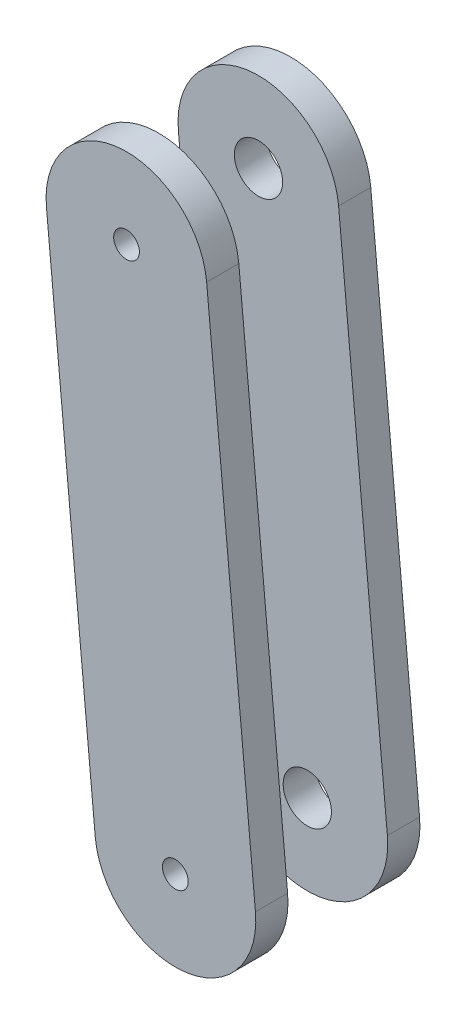
ISO-10303-21;
HEADER;
FILE_DESCRIPTION(('STEP AP214'),'2;1');
FILE_NAME('part.step','',(''),(''),'','','');
FILE_SCHEMA(('AUTOMOTIVE_DESIGN { 1 0 10303 214 1 1 1 1 }'));
ENDSEC;
DATA;
#1=APPLICATION_CONTEXT('core data for automotive mechanical design processes');
#2=APPLICATION_PROTOCOL_DEFINITION('international standard','automotive_design',2000,#1);
#3=PRODUCT_CONTEXT('',#1,'mechanical');
#4=PRODUCT('Part','Part','',(#3));
#5=PRODUCT_RELATED_PRODUCT_CATEGORY('part','',(#4));
#6=PRODUCT_DEFINITION_FORMATION('','',#4);
#7=PRODUCT_DEFINITION_CONTEXT('part definition',#1,'design');
#8=PRODUCT_DEFINITION('design','',#6,#7);
#9=PRODUCT_DEFINITION_SHAPE('','',#8);
#10=(LENGTH_UNIT() NAMED_UNIT(*) SI_UNIT(.MILLI.,.METRE.));
#11=(NAMED_UNIT(*) PLANE_ANGLE_UNIT() SI_UNIT($,.RADIAN.));
#12=(NAMED_UNIT(*) SI_UNIT($,.STERADIAN.) SOLID_ANGLE_UNIT());
#13=UNCERTAINTY_MEASURE_WITH_UNIT(LENGTH_MEASURE(1.E-05),#10,'distance_accuracy_value','');
#14=(GEOMETRIC_REPRESENTATION_CONTEXT(3) GLOBAL_UNCERTAINTY_ASSIGNED_CONTEXT((#13)) GLOBAL_UNIT_ASSIGNED_CONTEXT((#10,
#11,#12)) REPRESENTATION_CONTEXT('',''));
#15=CARTESIAN_POINT('',(0.,0.,0.));
#16=DIRECTION('',(0.,0.,1.));
#17=DIRECTION('',(1.,0.,0.));
#18=AXIS2_PLACEMENT_3D('',#15,#16,#17);
#19=CARTESIAN_POINT('',(-36.066679679603,64.7397826272147,-16.4));
#20=DIRECTION('',(0.,0.,-1.));
#21=DIRECTION('',(-1.,0.,0.));
#22=AXIS2_PLACEMENT_3D('',#19,#20,#21);
#23=PLANE('',#22);
#24=CARTESIAN_POINT('',(-30.,0.,-16.4));
#25=DIRECTION('',(0.,0.,-1.));
#26=DIRECTION('',(-1.,0.,0.));
#27=AXIS2_PLACEMENT_3D('',#24,#25,#26);
#28=CIRCLE('',#27,3.);
#29=CARTESIAN_POINT('',(-33.,0.,-16.4));
#30=VERTEX_POINT('',#29);
#31=EDGE_CURVE('E110',#30,#30,#28,.T.);
#32=ORIENTED_EDGE('',*,*,#31,.F.);
#33=EDGE_LOOP('',(#32));
#34=FACE_BOUND('',#33,.T.);
#35=CARTESIAN_POINT('',(-36.066679679603,64.7397826272147,-16.4));
#36=DIRECTION('',(0.,0.,-1.));
#37=DIRECTION('',(-1.,0.,0.));
#38=AXIS2_PLACEMENT_3D('',#35,#36,#37);
#39=CIRCLE('',#38,9.99999999999999);
#40=CARTESIAN_POINT('',(-46.0230601628289,63.8067833382336,-16.4));
#41=VERTEX_POINT('',#40);
#42=CARTESIAN_POINT('',(-26.1102991963772,65.6727819161958,-16.4));
#43=VERTEX_POINT('',#42);
#44=EDGE_CURVE('E95',#41,#43,#39,.T.);
#45=ORIENTED_EDGE('',*,*,#44,.T.);
#46=DIRECTION('',(0.0932999288981102,-0.995638048322586,0.));
#47=VECTOR('',#46,1.);
#48=CARTESIAN_POINT('',(-26.1102991963772,65.6727819161958,-16.4));
#49=LINE('',#48,#47);
#50=CARTESIAN_POINT('',(-20.0436195167741,0.932999288981099,-16.4));
#51=VERTEX_POINT('',#50);
#52=EDGE_CURVE('E90',#43,#51,#49,.T.);
#53=ORIENTED_EDGE('',*,*,#52,.T.);
#54=CARTESIAN_POINT('',(-30.,0.,-16.4));
#55=DIRECTION('',(0.,0.,-1.));
#56=DIRECTION('',(-1.,0.,0.));
#57=AXIS2_PLACEMENT_3D('',#54,#55,#56);
#58=CIRCLE('',#57,9.99999999999999);
#59=CARTESIAN_POINT('',(-39.9563804832258,-0.9329992889811,-16.4));
#60=VERTEX_POINT('',#59);
#61=EDGE_CURVE('E93',#51,#60,#58,.T.);
#62=ORIENTED_EDGE('',*,*,#61,.T.);
#63=DIRECTION('',(-0.0932999288981101,0.995638048322586,0.));
#64=VECTOR('',#63,1.);
#65=CARTESIAN_POINT('',(-39.9563804832258,-0.9329992889811,-16.4));
#66=LINE('',#65,#64);
#67=EDGE_CURVE('E60',#60,#41,#66,.T.);
#68=ORIENTED_EDGE('',*,*,#67,.T.);
#69=EDGE_LOOP('',(#45,#53,#62,#68));
#70=FACE_BOUND('',#69,.T.);
#71=CARTESIAN_POINT('',(-36.066679679603,64.7397826272147,-16.4));
#72=DIRECTION('',(0.,0.,-1.));
#73=DIRECTION('',(-1.,0.,0.));
#74=AXIS2_PLACEMENT_3D('',#71,#72,#73);
#75=CIRCLE('',#74,3.);
#76=CARTESIAN_POINT('',(-39.066679679603,64.7397826272147,-16.4));
#77=VERTEX_POINT('',#76);
#78=EDGE_CURVE('E125',#77,#77,#75,.T.);
#79=ORIENTED_EDGE('',*,*,#78,.F.);
#80=EDGE_LOOP('',(#79));
#81=FACE_BOUND('',#80,.T.);
#82=ADVANCED_FACE('F43',(#34,#70,#81),#23,.T.);
#83=CARTESIAN_POINT('',(-36.066679679603,64.7397826272147,-12.4));
#84=DIRECTION('',(0.,0.,-1.));
#85=DIRECTION('',(-1.,0.,0.));
#86=AXIS2_PLACEMENT_3D('',#83,#84,#85);
#87=PLANE('',#86);
#88=CARTESIAN_POINT('',(-36.066679679603,64.7397826272147,-12.4));
#89=DIRECTION('',(0.,0.,-1.));
#90=DIRECTION('',(-1.,0.,0.));
#91=AXIS2_PLACEMENT_3D('',#88,#89,#90);
#92=CIRCLE('',#91,9.99999999999999);
#93=CARTESIAN_POINT('',(-46.0230601628289,63.8067833382336,-12.4));
#94=VERTEX_POINT('',#93);
#95=CARTESIAN_POINT('',(-26.1102991963772,65.6727819161958,-12.4));
#96=VERTEX_POINT('',#95);
#97=EDGE_CURVE('E107',#94,#96,#92,.T.);
#98=ORIENTED_EDGE('',*,*,#97,.F.);
#99=DIRECTION('',(-0.0932999288981101,0.995638048322586,0.));
#100=VECTOR('',#99,1.);
#101=CARTESIAN_POINT('',(-39.9563804832258,-0.9329992889811,-12.4));
#102=LINE('',#101,#100);
#103=CARTESIAN_POINT('',(-39.9563804832258,-0.9329992889811,-12.4));
#104=VERTEX_POINT('',#103);
#105=EDGE_CURVE('E83',#104,#94,#102,.T.);
#106=ORIENTED_EDGE('',*,*,#105,.F.);
#107=CARTESIAN_POINT('',(-30.,0.,-12.4));
#108=DIRECTION('',(0.,0.,-1.));
#109=DIRECTION('',(-1.,0.,0.));
#110=AXIS2_PLACEMENT_3D('',#107,#108,#109);
#111=CIRCLE('',#110,9.99999999999999);
#112=CARTESIAN_POINT('',(-20.0436195167741,0.932999288981099,-12.4));
#113=VERTEX_POINT('',#112);
#114=EDGE_CURVE('E77',#113,#104,#111,.T.);
#115=ORIENTED_EDGE('',*,*,#114,.F.);
#116=DIRECTION('',(0.0932999288981102,-0.995638048322586,0.));
#117=VECTOR('',#116,1.);
#118=CARTESIAN_POINT('',(-26.1102991963772,65.6727819161958,-12.4));
#119=LINE('',#118,#117);
#120=EDGE_CURVE('E99',#96,#113,#119,.T.);
#121=ORIENTED_EDGE('',*,*,#120,.F.);
#122=EDGE_LOOP('',(#98,#106,#115,#121));
#123=FACE_BOUND('',#122,.T.);
#124=CARTESIAN_POINT('',(-30.,0.,-12.4));
#125=DIRECTION('',(0.,0.,-1.));
#126=DIRECTION('',(-1.,0.,0.));
#127=AXIS2_PLACEMENT_3D('',#124,#125,#126);
#128=CIRCLE('',#127,3.);
#129=CARTESIAN_POINT('',(-33.,0.,-12.4));
#130=VERTEX_POINT('',#129);
#131=EDGE_CURVE('E122',#130,#130,#128,.T.);
#132=ORIENTED_EDGE('',*,*,#131,.T.);
#133=EDGE_LOOP('',(#132));
#134=FACE_BOUND('',#133,.T.);
#135=CARTESIAN_POINT('',(-36.066679679603,64.7397826272147,-12.4));
#136=DIRECTION('',(0.,0.,-1.));
#137=DIRECTION('',(-1.,0.,0.));
#138=AXIS2_PLACEMENT_3D('',#135,#136,#137);
#139=CIRCLE('',#138,3.);
#140=CARTESIAN_POINT('',(-39.066679679603,64.7397826272147,-12.4));
#141=VERTEX_POINT('',#140);
#142=EDGE_CURVE('E128',#141,#141,#139,.T.);
#143=ORIENTED_EDGE('',*,*,#142,.T.);
#144=EDGE_LOOP('',(#143));
#145=FACE_BOUND('',#144,.T.);
#146=ADVANCED_FACE('F118',(#123,#134,#145),#87,.F.);
#147=CARTESIAN_POINT('',(-36.066679679603,64.7397826272147,-16.4));
#148=DIRECTION('',(0.,0.,1.));
#149=DIRECTION('',(1.,0.,0.));
#150=AXIS2_PLACEMENT_3D('',#147,#148,#149);
#151=CYLINDRICAL_SURFACE('',#150,9.99999999999999);
#152=ORIENTED_EDGE('',*,*,#97,.T.);
#153=DIRECTION('',(0.,0.,1.));
#154=VECTOR('',#153,1.);
#155=CARTESIAN_POINT('',(-26.1102991963772,65.6727819161958,-16.4));
#156=LINE('',#155,#154);
#157=EDGE_CURVE('E12',#43,#96,#156,.T.);
#158=ORIENTED_EDGE('',*,*,#157,.F.);
#159=ORIENTED_EDGE('',*,*,#44,.F.);
#160=DIRECTION('',(0.,0.,1.));
#161=VECTOR('',#160,1.);
#162=CARTESIAN_POINT('',(-46.0230601628289,63.8067833382336,-16.4));
#163=LINE('',#162,#161);
#164=EDGE_CURVE('E103',#41,#94,#163,.T.);
#165=ORIENTED_EDGE('',*,*,#164,.T.);
#166=EDGE_LOOP('',(#152,#158,#159,#165));
#167=FACE_BOUND('',#166,.T.);
#168=ADVANCED_FACE('F45',(#167),#151,.T.);
#169=CARTESIAN_POINT('',(-26.1102991963772,65.6727819161958,-16.4));
#170=DIRECTION('',(-0.995638048322586,-0.0932999288981102,0.));
#171=DIRECTION('',(0.0932999288981102,-0.995638048322586,0.));
#172=AXIS2_PLACEMENT_3D('',#169,#170,#171);
#173=PLANE('',#172);
#174=ORIENTED_EDGE('',*,*,#120,.T.);
#175=DIRECTION('',(0.,0.,1.));
#176=VECTOR('',#175,1.);
#177=CARTESIAN_POINT('',(-20.0436195167741,0.932999288981099,-16.4));
#178=LINE('',#177,#176);
#179=EDGE_CURVE('E52',#51,#113,#178,.T.);
#180=ORIENTED_EDGE('',*,*,#179,.F.);
#181=ORIENTED_EDGE('',*,*,#52,.F.);
#182=ORIENTED_EDGE('',*,*,#157,.T.);
#183=EDGE_LOOP('',(#174,#180,#181,#182));
#184=FACE_BOUND('',#183,.T.);
#185=ADVANCED_FACE('F98',(#184),#173,.F.);
#186=CARTESIAN_POINT('',(-30.,0.,-16.4));
#187=DIRECTION('',(0.,0.,1.));
#188=DIRECTION('',(1.,0.,0.));
#189=AXIS2_PLACEMENT_3D('',#186,#187,#188);
#190=CYLINDRICAL_SURFACE('',#189,9.99999999999999);
#191=ORIENTED_EDGE('',*,*,#114,.T.);
#192=DIRECTION('',(0.,0.,1.));
#193=VECTOR('',#192,1.);
#194=CARTESIAN_POINT('',(-39.9563804832258,-0.9329992889811,-16.4));
#195=LINE('',#194,#193);
#196=EDGE_CURVE('E100',#60,#104,#195,.T.);
#197=ORIENTED_EDGE('',*,*,#196,.F.);
#198=ORIENTED_EDGE('',*,*,#61,.F.);
#199=ORIENTED_EDGE('',*,*,#179,.T.);
#200=EDGE_LOOP('',(#191,#197,#198,#199));
#201=FACE_BOUND('',#200,.T.);
#202=ADVANCED_FACE('F101',(#201),#190,.T.);
#203=CARTESIAN_POINT('',(-39.9563804832258,-0.9329992889811,-16.4));
#204=DIRECTION('',(0.995638048322586,0.0932999288981101,0.));
#205=DIRECTION('',(-0.0932999288981101,0.995638048322586,0.));
#206=AXIS2_PLACEMENT_3D('',#203,#204,#205);
#207=PLANE('',#206);
#208=ORIENTED_EDGE('',*,*,#105,.T.);
#209=ORIENTED_EDGE('',*,*,#164,.F.);
#210=ORIENTED_EDGE('',*,*,#67,.F.);
#211=ORIENTED_EDGE('',*,*,#196,.T.);
#212=EDGE_LOOP('',(#208,#209,#210,#211));
#213=FACE_BOUND('',#212,.T.);
#214=ADVANCED_FACE('F115',(#213),#207,.F.);
#215=CARTESIAN_POINT('',(-30.,0.,-16.4));
#216=DIRECTION('',(0.,0.,1.));
#217=DIRECTION('',(1.,0.,0.));
#218=AXIS2_PLACEMENT_3D('',#215,#216,#217);
#219=CYLINDRICAL_SURFACE('',#218,3.);
#220=ORIENTED_EDGE('',*,*,#31,.T.);
#221=EDGE_LOOP('',(#220));
#222=FACE_BOUND('',#221,.T.);
#223=ORIENTED_EDGE('',*,*,#131,.F.);
#224=EDGE_LOOP('',(#223));
#225=FACE_BOUND('',#224,.T.);
#226=ADVANCED_FACE('F145',(#222,#225),#219,.F.);
#227=CARTESIAN_POINT('',(-36.066679679603,64.7397826272147,-16.4));
#228=DIRECTION('',(0.,0.,1.));
#229=DIRECTION('',(1.,0.,0.));
#230=AXIS2_PLACEMENT_3D('',#227,#228,#229);
#231=CYLINDRICAL_SURFACE('',#230,3.);
#232=ORIENTED_EDGE('',*,*,#78,.T.);
#233=EDGE_LOOP('',(#232));
#234=FACE_BOUND('',#233,.T.);
#235=ORIENTED_EDGE('',*,*,#142,.F.);
#236=EDGE_LOOP('',(#235));
#237=FACE_BOUND('',#236,.T.);
#238=ADVANCED_FACE('F134',(#234,#237),#231,.F.);
#239=CLOSED_SHELL('',(#82,#146,#168,#185,#202,#214,#226,#238));
#240=MANIFOLD_SOLID_BREP('B2',#239);
#241=CARTESIAN_POINT('',(-36.066679679603,64.7397826272147,4.));
#242=DIRECTION('',(0.,0.,1.));
#243=DIRECTION('',(1.,0.,0.));
#244=AXIS2_PLACEMENT_3D('',#241,#242,#243);
#245=PLANE('',#244);
#246=CARTESIAN_POINT('',(-36.066679679603,64.7397826272147,4.));
#247=DIRECTION('',(0.,0.,1.));
#248=DIRECTION('',(1.,0.,0.));
#249=AXIS2_PLACEMENT_3D('',#246,#247,#248);
#250=CIRCLE('',#249,1.59999999999999);
#251=CARTESIAN_POINT('',(-34.466679679603,64.7397826272147,4.));
#252=VERTEX_POINT('',#251);
#253=EDGE_CURVE('E276',#252,#252,#250,.T.);
#254=ORIENTED_EDGE('',*,*,#253,.F.);
#255=EDGE_LOOP('',(#254));
#256=FACE_BOUND('',#255,.T.);
#257=CARTESIAN_POINT('',(-36.066679679603,64.7397826272147,4.));
#258=DIRECTION('',(0.,0.,1.));
#259=DIRECTION('',(1.,0.,0.));
#260=AXIS2_PLACEMENT_3D('',#257,#258,#259);
#261=CIRCLE('',#260,9.99999999999999);
#262=CARTESIAN_POINT('',(-26.1102991963772,65.6727819161958,4.));
#263=VERTEX_POINT('',#262);
#264=CARTESIAN_POINT('',(-46.0230601628289,63.8067833382336,4.));
#265=VERTEX_POINT('',#264);
#266=EDGE_CURVE('E261',#263,#265,#261,.T.);
#267=ORIENTED_EDGE('',*,*,#266,.T.);
#268=DIRECTION('',(0.0932999288981102,-0.995638048322586,0.));
#269=VECTOR('',#268,1.);
#270=CARTESIAN_POINT('',(-46.0230601628289,63.8067833382336,4.));
#271=LINE('',#270,#269);
#272=CARTESIAN_POINT('',(-39.9563804832258,-0.9329992889811,4.));
#273=VERTEX_POINT('',#272);
#274=EDGE_CURVE('E256',#265,#273,#271,.T.);
#275=ORIENTED_EDGE('',*,*,#274,.T.);
#276=CARTESIAN_POINT('',(-30.,0.,4.));
#277=DIRECTION('',(0.,0.,1.));
#278=DIRECTION('',(1.,0.,0.));
#279=AXIS2_PLACEMENT_3D('',#276,#277,#278);
#280=CIRCLE('',#279,9.99999999999999);
#281=CARTESIAN_POINT('',(-20.0436195167741,0.932999288981098,4.));
#282=VERTEX_POINT('',#281);
#283=EDGE_CURVE('E259',#273,#282,#280,.T.);
#284=ORIENTED_EDGE('',*,*,#283,.T.);
#285=DIRECTION('',(-0.09329992889811,0.995638048322586,0.));
#286=VECTOR('',#285,1.);
#287=CARTESIAN_POINT('',(-26.1102991963772,65.6727819161958,4.));
#288=LINE('',#287,#286);
#289=EDGE_CURVE('E226',#282,#263,#288,.T.);
#290=ORIENTED_EDGE('',*,*,#289,.T.);
#291=EDGE_LOOP('',(#267,#275,#284,#290));
#292=FACE_BOUND('',#291,.T.);
#293=CARTESIAN_POINT('',(-30.,0.,4.));
#294=DIRECTION('',(0.,0.,1.));
#295=DIRECTION('',(1.,0.,0.));
#296=AXIS2_PLACEMENT_3D('',#293,#294,#295);
#297=CIRCLE('',#296,1.6);
#298=CARTESIAN_POINT('',(-28.4,0.,4.));
#299=VERTEX_POINT('',#298);
#300=EDGE_CURVE('E291',#299,#299,#297,.T.);
#301=ORIENTED_EDGE('',*,*,#300,.F.);
#302=EDGE_LOOP('',(#301));
#303=FACE_BOUND('',#302,.T.);
#304=ADVANCED_FACE('F209',(#256,#292,#303),#245,.T.);
#305=CARTESIAN_POINT('',(-36.066679679603,64.7397826272147,0.));
#306=DIRECTION('',(0.,0.,1.));
#307=DIRECTION('',(1.,0.,0.));
#308=AXIS2_PLACEMENT_3D('',#305,#306,#307);
#309=PLANE('',#308);
#310=CARTESIAN_POINT('',(-36.066679679603,64.7397826272147,0.));
#311=DIRECTION('',(0.,0.,1.));
#312=DIRECTION('',(1.,0.,0.));
#313=AXIS2_PLACEMENT_3D('',#310,#311,#312);
#314=CIRCLE('',#313,9.99999999999999);
#315=CARTESIAN_POINT('',(-26.1102991963772,65.6727819161958,0.));
#316=VERTEX_POINT('',#315);
#317=CARTESIAN_POINT('',(-46.0230601628289,63.8067833382336,0.));
#318=VERTEX_POINT('',#317);
#319=EDGE_CURVE('E273',#316,#318,#314,.T.);
#320=ORIENTED_EDGE('',*,*,#319,.F.);
#321=DIRECTION('',(-0.09329992889811,0.995638048322586,0.));
#322=VECTOR('',#321,1.);
#323=CARTESIAN_POINT('',(-26.1102991963772,65.6727819161958,0.));
#324=LINE('',#323,#322);
#325=CARTESIAN_POINT('',(-20.0436195167741,0.932999288981098,0.));
#326=VERTEX_POINT('',#325);
#327=EDGE_CURVE('E249',#326,#316,#324,.T.);
#328=ORIENTED_EDGE('',*,*,#327,.F.);
#329=CARTESIAN_POINT('',(-30.,0.,0.));
#330=DIRECTION('',(0.,0.,1.));
#331=DIRECTION('',(1.,0.,0.));
#332=AXIS2_PLACEMENT_3D('',#329,#330,#331);
#333=CIRCLE('',#332,9.99999999999999);
#334=CARTESIAN_POINT('',(-39.9563804832258,-0.9329992889811,0.));
#335=VERTEX_POINT('',#334);
#336=EDGE_CURVE('E243',#335,#326,#333,.T.);
#337=ORIENTED_EDGE('',*,*,#336,.F.);
#338=DIRECTION('',(0.0932999288981102,-0.995638048322586,0.));
#339=VECTOR('',#338,1.);
#340=CARTESIAN_POINT('',(-46.0230601628289,63.8067833382336,0.));
#341=LINE('',#340,#339);
#342=EDGE_CURVE('E265',#318,#335,#341,.T.);
#343=ORIENTED_EDGE('',*,*,#342,.F.);
#344=EDGE_LOOP('',(#320,#328,#337,#343));
#345=FACE_BOUND('',#344,.T.);
#346=CARTESIAN_POINT('',(-36.066679679603,64.7397826272147,0.));
#347=DIRECTION('',(0.,0.,1.));
#348=DIRECTION('',(1.,0.,0.));
#349=AXIS2_PLACEMENT_3D('',#346,#347,#348);
#350=CIRCLE('',#349,1.59999999999999);
#351=CARTESIAN_POINT('',(-34.466679679603,64.7397826272147,0.));
#352=VERTEX_POINT('',#351);
#353=EDGE_CURVE('E288',#352,#352,#350,.T.);
#354=ORIENTED_EDGE('',*,*,#353,.T.);
#355=EDGE_LOOP('',(#354));
#356=FACE_BOUND('',#355,.T.);
#357=CARTESIAN_POINT('',(-30.,0.,0.));
#358=DIRECTION('',(0.,0.,1.));
#359=DIRECTION('',(1.,0.,0.));
#360=AXIS2_PLACEMENT_3D('',#357,#358,#359);
#361=CIRCLE('',#360,1.6);
#362=CARTESIAN_POINT('',(-28.4,0.,0.));
#363=VERTEX_POINT('',#362);
#364=EDGE_CURVE('E294',#363,#363,#361,.T.);
#365=ORIENTED_EDGE('',*,*,#364,.T.);
#366=EDGE_LOOP('',(#365));
#367=FACE_BOUND('',#366,.T.);
#368=ADVANCED_FACE('F284',(#345,#356,#367),#309,.F.);
#369=CARTESIAN_POINT('',(-36.066679679603,64.7397826272147,4.));
#370=DIRECTION('',(0.,0.,-1.));
#371=DIRECTION('',(-1.,0.,0.));
#372=AXIS2_PLACEMENT_3D('',#369,#370,#371);
#373=CYLINDRICAL_SURFACE('',#372,9.99999999999999);
#374=ORIENTED_EDGE('',*,*,#319,.T.);
#375=DIRECTION('',(0.,0.,-1.));
#376=VECTOR('',#375,1.);
#377=CARTESIAN_POINT('',(-46.0230601628289,63.8067833382336,4.));
#378=LINE('',#377,#376);
#379=EDGE_CURVE('E41',#265,#318,#378,.T.);
#380=ORIENTED_EDGE('',*,*,#379,.F.);
#381=ORIENTED_EDGE('',*,*,#266,.F.);
#382=DIRECTION('',(0.,0.,-1.));
#383=VECTOR('',#382,1.);
#384=CARTESIAN_POINT('',(-26.1102991963772,65.6727819161958,4.));
#385=LINE('',#384,#383);
#386=EDGE_CURVE('E269',#263,#316,#385,.T.);
#387=ORIENTED_EDGE('',*,*,#386,.T.);
#388=EDGE_LOOP('',(#374,#380,#381,#387));
#389=FACE_BOUND('',#388,.T.);
#390=ADVANCED_FACE('F211',(#389),#373,.T.);
#391=CARTESIAN_POINT('',(-46.0230601628289,63.8067833382336,4.));
#392=DIRECTION('',(0.995638048322586,0.0932999288981102,0.));
#393=DIRECTION('',(-0.0932999288981102,0.995638048322586,0.));
#394=AXIS2_PLACEMENT_3D('',#391,#392,#393);
#395=PLANE('',#394);
#396=ORIENTED_EDGE('',*,*,#342,.T.);
#397=DIRECTION('',(0.,0.,-1.));
#398=VECTOR('',#397,1.);
#399=CARTESIAN_POINT('',(-39.9563804832258,-0.9329992889811,4.));
#400=LINE('',#399,#398);
#401=EDGE_CURVE('E218',#273,#335,#400,.T.);
#402=ORIENTED_EDGE('',*,*,#401,.F.);
#403=ORIENTED_EDGE('',*,*,#274,.F.);
#404=ORIENTED_EDGE('',*,*,#379,.T.);
#405=EDGE_LOOP('',(#396,#402,#403,#404));
#406=FACE_BOUND('',#405,.T.);
#407=ADVANCED_FACE('F264',(#406),#395,.F.);
#408=CARTESIAN_POINT('',(-30.,0.,4.));
#409=DIRECTION('',(0.,0.,-1.));
#410=DIRECTION('',(-1.,0.,0.));
#411=AXIS2_PLACEMENT_3D('',#408,#409,#410);
#412=CYLINDRICAL_SURFACE('',#411,9.99999999999999);
#413=ORIENTED_EDGE('',*,*,#336,.T.);
#414=DIRECTION('',(0.,0.,-1.));
#415=VECTOR('',#414,1.);
#416=CARTESIAN_POINT('',(-20.0436195167741,0.932999288981098,4.));
#417=LINE('',#416,#415);
#418=EDGE_CURVE('E266',#282,#326,#417,.T.);
#419=ORIENTED_EDGE('',*,*,#418,.F.);
#420=ORIENTED_EDGE('',*,*,#283,.F.);
#421=ORIENTED_EDGE('',*,*,#401,.T.);
#422=EDGE_LOOP('',(#413,#419,#420,#421));
#423=FACE_BOUND('',#422,.T.);
#424=ADVANCED_FACE('F267',(#423),#412,.T.);
#425=CARTESIAN_POINT('',(-26.1102991963772,65.6727819161958,4.));
#426=DIRECTION('',(-0.995638048322586,-0.09329992889811,0.));
#427=DIRECTION('',(0.09329992889811,-0.995638048322586,0.));
#428=AXIS2_PLACEMENT_3D('',#425,#426,#427);
#429=PLANE('',#428);
#430=ORIENTED_EDGE('',*,*,#327,.T.);
#431=ORIENTED_EDGE('',*,*,#386,.F.);
#432=ORIENTED_EDGE('',*,*,#289,.F.);
#433=ORIENTED_EDGE('',*,*,#418,.T.);
#434=EDGE_LOOP('',(#430,#431,#432,#433));
#435=FACE_BOUND('',#434,.T.);
#436=ADVANCED_FACE('F281',(#435),#429,.F.);
#437=CARTESIAN_POINT('',(-36.066679679603,64.7397826272147,4.));
#438=DIRECTION('',(0.,0.,-1.));
#439=DIRECTION('',(-1.,0.,0.));
#440=AXIS2_PLACEMENT_3D('',#437,#438,#439);
#441=CYLINDRICAL_SURFACE('',#440,1.59999999999999);
#442=ORIENTED_EDGE('',*,*,#253,.T.);
#443=EDGE_LOOP('',(#442));
#444=FACE_BOUND('',#443,.T.);
#445=ORIENTED_EDGE('',*,*,#353,.F.);
#446=EDGE_LOOP('',(#445));
#447=FACE_BOUND('',#446,.T.);
#448=ADVANCED_FACE('F311',(#444,#447),#441,.F.);
#449=CARTESIAN_POINT('',(-30.,0.,4.));
#450=DIRECTION('',(0.,0.,-1.));
#451=DIRECTION('',(-1.,0.,0.));
#452=AXIS2_PLACEMENT_3D('',#449,#450,#451);
#453=CYLINDRICAL_SURFACE('',#452,1.6);
#454=ORIENTED_EDGE('',*,*,#300,.T.);
#455=EDGE_LOOP('',(#454));
#456=FACE_BOUND('',#455,.T.);
#457=ORIENTED_EDGE('',*,*,#364,.F.);
#458=EDGE_LOOP('',(#457));
#459=FACE_BOUND('',#458,.T.);
#460=ADVANCED_FACE('F300',(#456,#459),#453,.F.);
#461=CLOSED_SHELL('',(#304,#368,#390,#407,#424,#436,#448,#460));
#462=MANIFOLD_SOLID_BREP('B6',#461);
#463=ADVANCED_BREP_SHAPE_REPRESENTATION('',(#18,#240,#462),#14);
#464=SHAPE_DEFINITION_REPRESENTATION(#9,#463);
ENDSEC;
END-ISO-10303-21;
